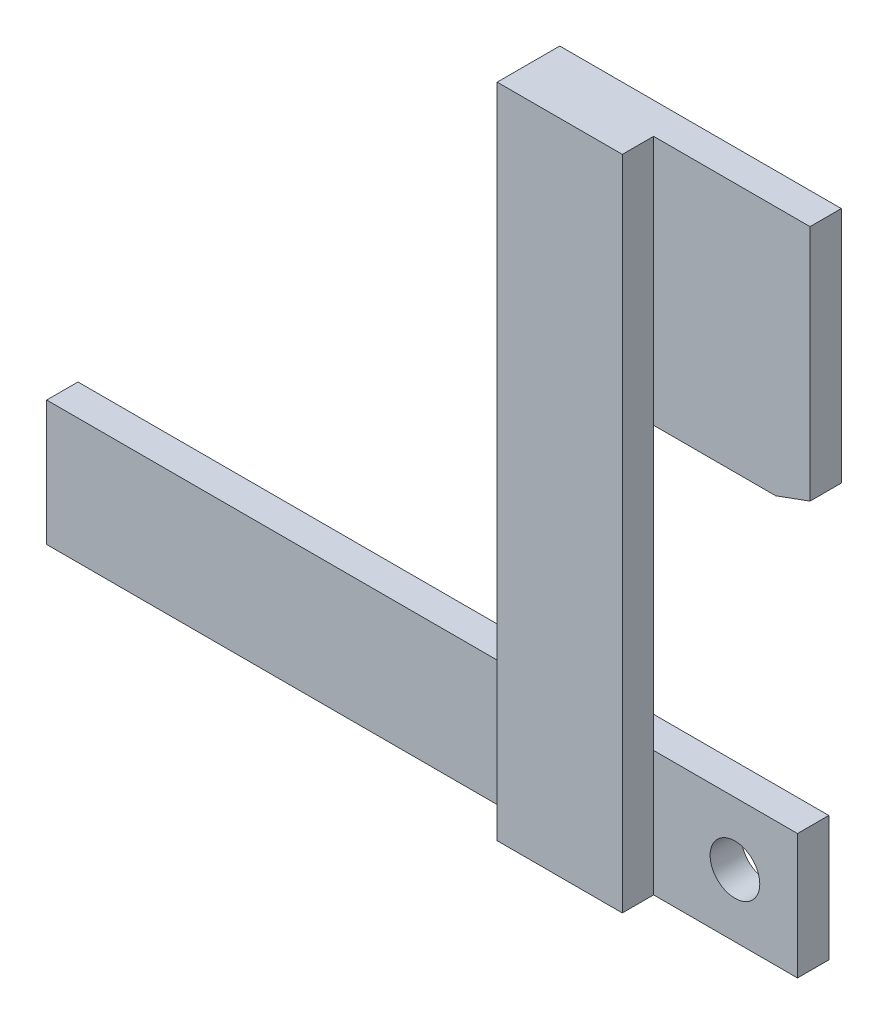
ISO-10303-21;
HEADER;
FILE_DESCRIPTION(('STEP AP214'),'2;1');
FILE_NAME('part.step','',(''),(''),'','','');
FILE_SCHEMA(('AUTOMOTIVE_DESIGN { 1 0 10303 214 1 1 1 1 }'));
ENDSEC;
DATA;
#1=APPLICATION_CONTEXT('core data for automotive mechanical design processes');
#2=APPLICATION_PROTOCOL_DEFINITION('international standard','automotive_design',2000,#1);
#3=PRODUCT_CONTEXT('',#1,'mechanical');
#4=PRODUCT('Part','Part','',(#3));
#5=PRODUCT_RELATED_PRODUCT_CATEGORY('part','',(#4));
#6=PRODUCT_DEFINITION_FORMATION('','',#4);
#7=PRODUCT_DEFINITION_CONTEXT('part definition',#1,'design');
#8=PRODUCT_DEFINITION('design','',#6,#7);
#9=PRODUCT_DEFINITION_SHAPE('','',#8);
#10=(LENGTH_UNIT() NAMED_UNIT(*) SI_UNIT(.MILLI.,.METRE.));
#11=(NAMED_UNIT(*) PLANE_ANGLE_UNIT() SI_UNIT($,.RADIAN.));
#12=(NAMED_UNIT(*) SI_UNIT($,.STERADIAN.) SOLID_ANGLE_UNIT());
#13=UNCERTAINTY_MEASURE_WITH_UNIT(LENGTH_MEASURE(1.E-05),#10,'distance_accuracy_value','');
#14=(GEOMETRIC_REPRESENTATION_CONTEXT(3) GLOBAL_UNCERTAINTY_ASSIGNED_CONTEXT((#13)) GLOBAL_UNIT_ASSIGNED_CONTEXT((#10,
#11,#12)) REPRESENTATION_CONTEXT('',''));
#15=CARTESIAN_POINT('',(0.,0.,0.));
#16=DIRECTION('',(0.,0.,1.));
#17=DIRECTION('',(1.,0.,0.));
#18=AXIS2_PLACEMENT_3D('',#15,#16,#17);
#19=CARTESIAN_POINT('',(46.9900000000001,120.65,6.35));
#20=DIRECTION('',(0.,0.,1.));
#21=DIRECTION('',(1.,0.,0.));
#22=AXIS2_PLACEMENT_3D('',#19,#20,#21);
#23=PLANE('',#22);
#24=DIRECTION('',(-1.,0.,0.));
#25=VECTOR('',#24,1.);
#26=CARTESIAN_POINT('',(21.5900000000001,69.85,6.35));
#27=LINE('',#26,#25);
#28=CARTESIAN_POINT('',(46.9900000000001,69.85,6.35));
#29=VERTEX_POINT('',#28);
#30=CARTESIAN_POINT('',(21.5900000000001,69.85,6.35));
#31=VERTEX_POINT('',#30);
#32=EDGE_CURVE('E164',#29,#31,#27,.T.);
#33=ORIENTED_EDGE('',*,*,#32,.F.);
#34=DIRECTION('',(0.,1.,0.));
#35=VECTOR('',#34,1.);
#36=CARTESIAN_POINT('',(46.9900000000001,-12.7,6.35));
#37=LINE('',#36,#35);
#38=CARTESIAN_POINT('',(46.9900000000001,12.7,6.35));
#39=VERTEX_POINT('',#38);
#40=EDGE_CURVE('E182',#39,#29,#37,.T.);
#41=ORIENTED_EDGE('',*,*,#40,.F.);
#42=DIRECTION('',(-1.,0.,0.));
#43=VECTOR('',#42,1.);
#44=CARTESIAN_POINT('',(-76.1999999999999,12.7,6.35));
#45=LINE('',#44,#43);
#46=CARTESIAN_POINT('',(21.5900000000001,12.7,6.35));
#47=VERTEX_POINT('',#46);
#48=EDGE_CURVE('E254',#39,#47,#45,.T.);
#49=ORIENTED_EDGE('',*,*,#48,.T.);
#50=DIRECTION('',(0.,-1.,0.));
#51=VECTOR('',#50,1.);
#52=CARTESIAN_POINT('',(21.5900000000001,-12.7,6.35));
#53=LINE('',#52,#51);
#54=EDGE_CURVE('E187',#31,#47,#53,.T.);
#55=ORIENTED_EDGE('',*,*,#54,.F.);
#56=EDGE_LOOP('',(#33,#41,#49,#55));
#57=FACE_BOUND('',#56,.T.);
#58=ADVANCED_FACE('F39',(#57),#23,.F.);
#59=CARTESIAN_POINT('',(76.2,12.7,6.35));
#60=DIRECTION('',(0.,0.,-1.));
#61=DIRECTION('',(-1.,0.,0.));
#62=AXIS2_PLACEMENT_3D('',#59,#60,#61);
#63=PLANE('',#62);
#64=CARTESIAN_POINT('',(63.5000000000001,0.,6.35));
#65=DIRECTION('',(0.,0.,1.));
#66=DIRECTION('',(1.,0.,0.));
#67=AXIS2_PLACEMENT_3D('',#64,#65,#66);
#68=CIRCLE('',#67,5.0419);
#69=CARTESIAN_POINT('',(68.5419000000001,0.,6.35));
#70=VERTEX_POINT('',#69);
#71=EDGE_CURVE('E459',#70,#70,#68,.T.);
#72=ORIENTED_EDGE('',*,*,#71,.F.);
#73=EDGE_LOOP('',(#72));
#74=FACE_BOUND('',#73,.T.);
#75=CARTESIAN_POINT('',(46.99,-12.7,6.35));
#76=VERTEX_POINT('',#75);
#77=EDGE_CURVE('E196',#76,#39,#37,.T.);
#78=ORIENTED_EDGE('',*,*,#77,.F.);
#79=DIRECTION('',(1.,0.,0.));
#80=VECTOR('',#79,1.);
#81=CARTESIAN_POINT('',(-76.1999999999999,-12.7,6.35));
#82=LINE('',#81,#80);
#83=CARTESIAN_POINT('',(76.2000000000001,-12.7,6.35));
#84=VERTEX_POINT('',#83);
#85=EDGE_CURVE('E223',#76,#84,#82,.T.);
#86=ORIENTED_EDGE('',*,*,#85,.T.);
#87=DIRECTION('',(0.,1.,0.));
#88=VECTOR('',#87,1.);
#89=CARTESIAN_POINT('',(76.2000000000001,-12.7,6.35));
#90=LINE('',#89,#88);
#91=CARTESIAN_POINT('',(76.2000000000001,12.7,6.35));
#92=VERTEX_POINT('',#91);
#93=EDGE_CURVE('E245',#84,#92,#90,.T.);
#94=ORIENTED_EDGE('',*,*,#93,.T.);
#95=EDGE_CURVE('E250',#92,#39,#45,.T.);
#96=ORIENTED_EDGE('',*,*,#95,.T.);
#97=EDGE_LOOP('',(#78,#86,#94,#96));
#98=FACE_BOUND('',#97,.T.);
#99=ADVANCED_FACE('F287',(#74,#98),#63,.F.);
#100=CARTESIAN_POINT('',(21.5900000000001,-12.7,6.35));
#101=VERTEX_POINT('',#100);
#102=EDGE_CURVE('E211',#47,#101,#53,.T.);
#103=ORIENTED_EDGE('',*,*,#102,.F.);
#104=CARTESIAN_POINT('',(-76.1999999999999,12.7,6.35));
#105=VERTEX_POINT('',#104);
#106=EDGE_CURVE('E248',#47,#105,#45,.T.);
#107=ORIENTED_EDGE('',*,*,#106,.T.);
#108=DIRECTION('',(0.,-1.,0.));
#109=VECTOR('',#108,1.);
#110=CARTESIAN_POINT('',(-76.1999999999999,-12.7,6.35));
#111=LINE('',#110,#109);
#112=CARTESIAN_POINT('',(-76.1999999999999,-12.7,6.35));
#113=VERTEX_POINT('',#112);
#114=EDGE_CURVE('E253',#105,#113,#111,.T.);
#115=ORIENTED_EDGE('',*,*,#114,.T.);
#116=EDGE_CURVE('E231',#113,#101,#82,.T.);
#117=ORIENTED_EDGE('',*,*,#116,.T.);
#118=EDGE_LOOP('',(#103,#107,#115,#117));
#119=FACE_BOUND('',#118,.T.);
#120=ADVANCED_FACE('F315',(#119),#63,.F.);
#121=CARTESIAN_POINT('',(76.2000000000001,-12.7,6.35));
#122=DIRECTION('',(-1.,0.,0.));
#123=DIRECTION('',(0.,0.,1.));
#124=AXIS2_PLACEMENT_3D('',#121,#122,#123);
#125=PLANE('',#124);
#126=DIRECTION('',(0.,1.,0.));
#127=VECTOR('',#126,1.);
#128=CARTESIAN_POINT('',(76.2000000000001,-12.7,0.));
#129=LINE('',#128,#127);
#130=CARTESIAN_POINT('',(76.2000000000001,-12.7,0.));
#131=VERTEX_POINT('',#130);
#132=CARTESIAN_POINT('',(76.2000000000001,12.7,0.));
#133=VERTEX_POINT('',#132);
#134=EDGE_CURVE('E239',#131,#133,#129,.T.);
#135=ORIENTED_EDGE('',*,*,#134,.T.);
#136=DIRECTION('',(0.,0.,-1.));
#137=VECTOR('',#136,1.);
#138=CARTESIAN_POINT('',(76.2000000000001,12.7,6.35));
#139=LINE('',#138,#137);
#140=EDGE_CURVE('E215',#92,#133,#139,.T.);
#141=ORIENTED_EDGE('',*,*,#140,.F.);
#142=ORIENTED_EDGE('',*,*,#93,.F.);
#143=DIRECTION('',(0.,0.,-1.));
#144=VECTOR('',#143,1.);
#145=CARTESIAN_POINT('',(76.2000000000001,-12.7,6.35));
#146=LINE('',#145,#144);
#147=EDGE_CURVE('E258',#84,#131,#146,.T.);
#148=ORIENTED_EDGE('',*,*,#147,.T.);
#149=EDGE_LOOP('',(#135,#141,#142,#148));
#150=FACE_BOUND('',#149,.T.);
#151=ADVANCED_FACE('F285',(#150),#125,.F.);
#152=CARTESIAN_POINT('',(-76.1999999999999,12.7,6.35));
#153=DIRECTION('',(0.,-1.,0.));
#154=DIRECTION('',(0.,0.,-1.));
#155=AXIS2_PLACEMENT_3D('',#152,#153,#154);
#156=PLANE('',#155);
#157=DIRECTION('',(-1.,0.,0.));
#158=VECTOR('',#157,1.);
#159=CARTESIAN_POINT('',(-76.1999999999999,12.7,0.));
#160=LINE('',#159,#158);
#161=CARTESIAN_POINT('',(-76.1999999999999,12.7,0.));
#162=VERTEX_POINT('',#161);
#163=EDGE_CURVE('E242',#133,#162,#160,.T.);
#164=ORIENTED_EDGE('',*,*,#163,.T.);
#165=DIRECTION('',(0.,0.,-1.));
#166=VECTOR('',#165,1.);
#167=CARTESIAN_POINT('',(-76.1999999999999,12.7,6.35));
#168=LINE('',#167,#166);
#169=EDGE_CURVE('E220',#105,#162,#168,.T.);
#170=ORIENTED_EDGE('',*,*,#169,.F.);
#171=ORIENTED_EDGE('',*,*,#106,.F.);
#172=ORIENTED_EDGE('',*,*,#48,.F.);
#173=ORIENTED_EDGE('',*,*,#95,.F.);
#174=ORIENTED_EDGE('',*,*,#140,.T.);
#175=EDGE_LOOP('',(#164,#170,#171,#172,#173,#174));
#176=FACE_BOUND('',#175,.T.);
#177=ADVANCED_FACE('F270',(#176),#156,.F.);
#178=CARTESIAN_POINT('',(-76.1999999999999,-12.7,6.35));
#179=DIRECTION('',(1.,0.,0.));
#180=DIRECTION('',(0.,0.,-1.));
#181=AXIS2_PLACEMENT_3D('',#178,#179,#180);
#182=PLANE('',#181);
#183=DIRECTION('',(0.,-1.,0.));
#184=VECTOR('',#183,1.);
#185=CARTESIAN_POINT('',(-76.1999999999999,-12.7,0.));
#186=LINE('',#185,#184);
#187=CARTESIAN_POINT('',(-76.1999999999999,-12.7,0.));
#188=VERTEX_POINT('',#187);
#189=EDGE_CURVE('E267',#162,#188,#186,.T.);
#190=ORIENTED_EDGE('',*,*,#189,.T.);
#191=DIRECTION('',(0.,0.,-1.));
#192=VECTOR('',#191,1.);
#193=CARTESIAN_POINT('',(-76.1999999999999,-12.7,6.35));
#194=LINE('',#193,#192);
#195=EDGE_CURVE('E262',#113,#188,#194,.T.);
#196=ORIENTED_EDGE('',*,*,#195,.F.);
#197=ORIENTED_EDGE('',*,*,#114,.F.);
#198=ORIENTED_EDGE('',*,*,#169,.T.);
#199=EDGE_LOOP('',(#190,#196,#197,#198));
#200=FACE_BOUND('',#199,.T.);
#201=ADVANCED_FACE('F278',(#200),#182,.F.);
#202=CARTESIAN_POINT('',(-76.1999999999999,-12.7,6.35));
#203=DIRECTION('',(0.,1.,0.));
#204=DIRECTION('',(0.,0.,1.));
#205=AXIS2_PLACEMENT_3D('',#202,#203,#204);
#206=PLANE('',#205);
#207=DIRECTION('',(1.,0.,0.));
#208=VECTOR('',#207,1.);
#209=CARTESIAN_POINT('',(-76.1999999999999,-12.7,0.));
#210=LINE('',#209,#208);
#211=EDGE_CURVE('E249',#188,#131,#210,.T.);
#212=ORIENTED_EDGE('',*,*,#211,.T.);
#213=ORIENTED_EDGE('',*,*,#147,.F.);
#214=ORIENTED_EDGE('',*,*,#85,.F.);
#215=DIRECTION('',(0.,0.,-1.));
#216=VECTOR('',#215,1.);
#217=CARTESIAN_POINT('',(46.9900000000001,-12.7,12.7));
#218=LINE('',#217,#216);
#219=CARTESIAN_POINT('',(46.9900000000001,-12.7,12.7));
#220=VERTEX_POINT('',#219);
#221=EDGE_CURVE('E192',#220,#76,#218,.T.);
#222=ORIENTED_EDGE('',*,*,#221,.F.);
#223=DIRECTION('',(1.,0.,0.));
#224=VECTOR('',#223,1.);
#225=CARTESIAN_POINT('',(46.9900000000001,-12.7,12.7));
#226=LINE('',#225,#224);
#227=CARTESIAN_POINT('',(21.5900000000001,-12.7,12.7));
#228=VERTEX_POINT('',#227);
#229=EDGE_CURVE('E190',#228,#220,#226,.T.);
#230=ORIENTED_EDGE('',*,*,#229,.F.);
#231=DIRECTION('',(0.,0.,-1.));
#232=VECTOR('',#231,1.);
#233=CARTESIAN_POINT('',(21.5900000000001,-12.7,12.7));
#234=LINE('',#233,#232);
#235=EDGE_CURVE('E147',#228,#101,#234,.T.);
#236=ORIENTED_EDGE('',*,*,#235,.T.);
#237=ORIENTED_EDGE('',*,*,#116,.F.);
#238=ORIENTED_EDGE('',*,*,#195,.T.);
#239=EDGE_LOOP('',(#212,#213,#214,#222,#230,#236,#237,#238));
#240=FACE_BOUND('',#239,.T.);
#241=ADVANCED_FACE('F229',(#240),#206,.F.);
#242=CARTESIAN_POINT('',(76.2,12.7,0.));
#243=DIRECTION('',(0.,0.,-1.));
#244=DIRECTION('',(-1.,0.,0.));
#245=AXIS2_PLACEMENT_3D('',#242,#243,#244);
#246=PLANE('',#245);
#247=CARTESIAN_POINT('',(63.5000000000001,0.,0.));
#248=DIRECTION('',(0.,0.,-1.));
#249=DIRECTION('',(-1.,0.,0.));
#250=AXIS2_PLACEMENT_3D('',#247,#248,#249);
#251=CIRCLE('',#250,5.04189999999999);
#252=CARTESIAN_POINT('',(58.4581000000001,0.,0.));
#253=VERTEX_POINT('',#252);
#254=EDGE_CURVE('E167',#253,#253,#251,.T.);
#255=ORIENTED_EDGE('',*,*,#254,.F.);
#256=EDGE_LOOP('',(#255));
#257=FACE_BOUND('',#256,.T.);
#258=ORIENTED_EDGE('',*,*,#134,.F.);
#259=ORIENTED_EDGE('',*,*,#211,.F.);
#260=ORIENTED_EDGE('',*,*,#189,.F.);
#261=ORIENTED_EDGE('',*,*,#163,.F.);
#262=EDGE_LOOP('',(#258,#259,#260,#261));
#263=FACE_BOUND('',#262,.T.);
#264=ADVANCED_FACE('F281',(#257,#263),#246,.T.);
#265=CARTESIAN_POINT('',(46.9900000000001,-12.7,12.7));
#266=DIRECTION('',(-1.,0.,0.));
#267=DIRECTION('',(0.,0.,1.));
#268=AXIS2_PLACEMENT_3D('',#265,#266,#267);
#269=PLANE('',#268);
#270=ORIENTED_EDGE('',*,*,#77,.T.);
#271=ORIENTED_EDGE('',*,*,#40,.T.);
#272=DIRECTION('',(0.,1.,0.));
#273=VECTOR('',#272,1.);
#274=CARTESIAN_POINT('',(46.9900000000001,-12.7,6.35));
#275=LINE('',#274,#273);
#276=CARTESIAN_POINT('',(46.9900000000001,120.65,6.35));
#277=VERTEX_POINT('',#276);
#278=EDGE_CURVE('E179',#29,#277,#275,.T.);
#279=ORIENTED_EDGE('',*,*,#278,.T.);
#280=DIRECTION('',(0.,0.,-1.));
#281=VECTOR('',#280,1.);
#282=CARTESIAN_POINT('',(46.9900000000001,120.65,12.7));
#283=LINE('',#282,#281);
#284=CARTESIAN_POINT('',(46.9900000000001,120.65,12.7));
#285=VERTEX_POINT('',#284);
#286=EDGE_CURVE('E146',#285,#277,#283,.T.);
#287=ORIENTED_EDGE('',*,*,#286,.F.);
#288=DIRECTION('',(0.,1.,0.));
#289=VECTOR('',#288,1.);
#290=CARTESIAN_POINT('',(46.9900000000001,-12.7,12.7));
#291=LINE('',#290,#289);
#292=EDGE_CURVE('E183',#220,#285,#291,.T.);
#293=ORIENTED_EDGE('',*,*,#292,.F.);
#294=ORIENTED_EDGE('',*,*,#221,.T.);
#295=EDGE_LOOP('',(#270,#271,#279,#287,#293,#294));
#296=FACE_BOUND('',#295,.T.);
#297=ADVANCED_FACE('F289',(#296),#269,.F.);
#298=CARTESIAN_POINT('',(46.9900000000001,120.65,12.7));
#299=DIRECTION('',(0.,-1.,0.));
#300=DIRECTION('',(1.,0.,0.));
#301=AXIS2_PLACEMENT_3D('',#298,#299,#300);
#302=PLANE('',#301);
#303=ORIENTED_EDGE('',*,*,#286,.T.);
#304=DIRECTION('',(1.,0.,0.));
#305=VECTOR('',#304,1.);
#306=CARTESIAN_POINT('',(21.5900000000001,120.65,6.35));
#307=LINE('',#306,#305);
#308=CARTESIAN_POINT('',(78.7400000000001,120.65,6.35));
#309=VERTEX_POINT('',#308);
#310=EDGE_CURVE('E173',#277,#309,#307,.T.);
#311=ORIENTED_EDGE('',*,*,#310,.T.);
#312=DIRECTION('',(0.,0.,1.));
#313=VECTOR('',#312,1.);
#314=CARTESIAN_POINT('',(78.7400000000001,120.65,0.));
#315=LINE('',#314,#313);
#316=CARTESIAN_POINT('',(78.7400000000001,120.65,0.));
#317=VERTEX_POINT('',#316);
#318=EDGE_CURVE('E154',#317,#309,#315,.T.);
#319=ORIENTED_EDGE('',*,*,#318,.F.);
#320=DIRECTION('',(1.,0.,0.));
#321=VECTOR('',#320,1.);
#322=CARTESIAN_POINT('',(21.5900000000001,120.65,0.));
#323=LINE('',#322,#321);
#324=CARTESIAN_POINT('',(21.5900000000001,120.65,0.));
#325=VERTEX_POINT('',#324);
#326=EDGE_CURVE('E150',#325,#317,#323,.T.);
#327=ORIENTED_EDGE('',*,*,#326,.F.);
#328=DIRECTION('',(0.,0.,-1.));
#329=VECTOR('',#328,1.);
#330=CARTESIAN_POINT('',(21.5900000000001,120.65,12.7));
#331=LINE('',#330,#329);
#332=CARTESIAN_POINT('',(21.5900000000001,120.65,12.7));
#333=VERTEX_POINT('',#332);
#334=EDGE_CURVE('E138',#333,#325,#331,.T.);
#335=ORIENTED_EDGE('',*,*,#334,.F.);
#336=DIRECTION('',(-1.,0.,0.));
#337=VECTOR('',#336,1.);
#338=CARTESIAN_POINT('',(46.9900000000001,120.65,12.7));
#339=LINE('',#338,#337);
#340=EDGE_CURVE('E186',#285,#333,#339,.T.);
#341=ORIENTED_EDGE('',*,*,#340,.F.);
#342=EDGE_LOOP('',(#303,#311,#319,#327,#335,#341));
#343=FACE_BOUND('',#342,.T.);
#344=ADVANCED_FACE('F152',(#343),#302,.F.);
#345=CARTESIAN_POINT('',(21.5900000000001,-12.7,12.7));
#346=DIRECTION('',(1.,0.,0.));
#347=DIRECTION('',(0.,0.,-1.));
#348=AXIS2_PLACEMENT_3D('',#345,#346,#347);
#349=PLANE('',#348);
#350=ORIENTED_EDGE('',*,*,#334,.T.);
#351=DIRECTION('',(0.,1.,0.));
#352=VECTOR('',#351,1.);
#353=CARTESIAN_POINT('',(21.5900000000001,120.65,0.));
#354=LINE('',#353,#352);
#355=CARTESIAN_POINT('',(21.5900000000001,69.85,0.));
#356=VERTEX_POINT('',#355);
#357=EDGE_CURVE('E142',#356,#325,#354,.T.);
#358=ORIENTED_EDGE('',*,*,#357,.F.);
#359=DIRECTION('',(0.,0.,1.));
#360=VECTOR('',#359,1.);
#361=CARTESIAN_POINT('',(21.5900000000001,69.85,0.));
#362=LINE('',#361,#360);
#363=EDGE_CURVE('E172',#356,#31,#362,.T.);
#364=ORIENTED_EDGE('',*,*,#363,.T.);
#365=ORIENTED_EDGE('',*,*,#54,.T.);
#366=ORIENTED_EDGE('',*,*,#102,.T.);
#367=ORIENTED_EDGE('',*,*,#235,.F.);
#368=DIRECTION('',(0.,-1.,0.));
#369=VECTOR('',#368,1.);
#370=CARTESIAN_POINT('',(21.5900000000001,-12.7,12.7));
#371=LINE('',#370,#369);
#372=EDGE_CURVE('E144',#333,#228,#371,.T.);
#373=ORIENTED_EDGE('',*,*,#372,.F.);
#374=EDGE_LOOP('',(#350,#358,#364,#365,#366,#367,#373));
#375=FACE_BOUND('',#374,.T.);
#376=ADVANCED_FACE('F140',(#375),#349,.F.);
#377=CARTESIAN_POINT('',(46.9900000000001,120.65,12.7));
#378=DIRECTION('',(0.,0.,1.));
#379=DIRECTION('',(1.,0.,0.));
#380=AXIS2_PLACEMENT_3D('',#377,#378,#379);
#381=PLANE('',#380);
#382=ORIENTED_EDGE('',*,*,#292,.T.);
#383=ORIENTED_EDGE('',*,*,#340,.T.);
#384=ORIENTED_EDGE('',*,*,#372,.T.);
#385=ORIENTED_EDGE('',*,*,#229,.T.);
#386=EDGE_LOOP('',(#382,#383,#384,#385));
#387=FACE_BOUND('',#386,.T.);
#388=ADVANCED_FACE('F236',(#387),#381,.T.);
#389=CARTESIAN_POINT('',(21.5900000000001,69.85,6.35));
#390=DIRECTION('',(0.,0.,1.));
#391=DIRECTION('',(1.,0.,0.));
#392=AXIS2_PLACEMENT_3D('',#389,#390,#391);
#393=PLANE('',#392);
#394=CARTESIAN_POINT('',(71.7614073545854,69.85,6.35));
#395=VERTEX_POINT('',#394);
#396=EDGE_CURVE('E162',#395,#29,#27,.T.);
#397=ORIENTED_EDGE('',*,*,#396,.F.);
#398=DIRECTION('',(-0.939692620785908,-0.342020143325671,0.));
#399=VECTOR('',#398,1.);
#400=CARTESIAN_POINT('',(27.4589397735735,53.7252204959681,6.35));
#401=LINE('',#400,#399);
#402=CARTESIAN_POINT('',(78.7400000000001,72.39,6.35));
#403=VERTEX_POINT('',#402);
#404=EDGE_CURVE('E61',#395,#403,#401,.F.);
#405=ORIENTED_EDGE('',*,*,#404,.T.);
#406=DIRECTION('',(0.,-1.,0.));
#407=VECTOR('',#406,1.);
#408=CARTESIAN_POINT('',(78.7400000000001,120.65,6.35));
#409=LINE('',#408,#407);
#410=EDGE_CURVE('E175',#309,#403,#409,.T.);
#411=ORIENTED_EDGE('',*,*,#410,.F.);
#412=ORIENTED_EDGE('',*,*,#310,.F.);
#413=ORIENTED_EDGE('',*,*,#278,.F.);
#414=EDGE_LOOP('',(#397,#405,#411,#412,#413));
#415=FACE_BOUND('',#414,.T.);
#416=ADVANCED_FACE('F297',(#415),#393,.T.);
#417=CARTESIAN_POINT('',(78.7400000000001,120.65,0.));
#418=DIRECTION('',(-1.,0.,0.));
#419=DIRECTION('',(0.,0.,1.));
#420=AXIS2_PLACEMENT_3D('',#417,#418,#419);
#421=PLANE('',#420);
#422=ORIENTED_EDGE('',*,*,#410,.T.);
#423=DIRECTION('',(0.,0.,-1.));
#424=VECTOR('',#423,1.);
#425=CARTESIAN_POINT('',(78.7400000000001,72.39,0.));
#426=LINE('',#425,#424);
#427=CARTESIAN_POINT('',(78.7400000000001,72.39,0.));
#428=VERTEX_POINT('',#427);
#429=EDGE_CURVE('E47',#403,#428,#426,.T.);
#430=ORIENTED_EDGE('',*,*,#429,.T.);
#431=DIRECTION('',(0.,-1.,0.));
#432=VECTOR('',#431,1.);
#433=CARTESIAN_POINT('',(78.7400000000001,120.65,0.));
#434=LINE('',#433,#432);
#435=EDGE_CURVE('E156',#317,#428,#434,.T.);
#436=ORIENTED_EDGE('',*,*,#435,.F.);
#437=ORIENTED_EDGE('',*,*,#318,.T.);
#438=EDGE_LOOP('',(#422,#430,#436,#437));
#439=FACE_BOUND('',#438,.T.);
#440=ADVANCED_FACE('F298',(#439),#421,.F.);
#441=CARTESIAN_POINT('',(21.5900000000001,69.85,0.));
#442=DIRECTION('',(0.,1.,0.));
#443=DIRECTION('',(0.,0.,1.));
#444=AXIS2_PLACEMENT_3D('',#441,#442,#443);
#445=PLANE('',#444);
#446=DIRECTION('',(-1.,0.,0.));
#447=VECTOR('',#446,1.);
#448=CARTESIAN_POINT('',(21.5900000000001,69.85,0.));
#449=LINE('',#448,#447);
#450=CARTESIAN_POINT('',(71.7614073545853,69.85,0.));
#451=VERTEX_POINT('',#450);
#452=EDGE_CURVE('E160',#451,#356,#449,.T.);
#453=ORIENTED_EDGE('',*,*,#452,.F.);
#454=DIRECTION('',(0.,0.,1.));
#455=VECTOR('',#454,1.);
#456=CARTESIAN_POINT('',(71.7614073545854,69.85,0.));
#457=LINE('',#456,#455);
#458=EDGE_CURVE('E208',#451,#395,#457,.T.);
#459=ORIENTED_EDGE('',*,*,#458,.T.);
#460=ORIENTED_EDGE('',*,*,#396,.T.);
#461=ORIENTED_EDGE('',*,*,#32,.T.);
#462=ORIENTED_EDGE('',*,*,#363,.F.);
#463=EDGE_LOOP('',(#453,#459,#460,#461,#462));
#464=FACE_BOUND('',#463,.T.);
#465=ADVANCED_FACE('F296',(#464),#445,.F.);
#466=CARTESIAN_POINT('',(21.5900000000001,69.85,0.));
#467=DIRECTION('',(0.,0.,1.));
#468=DIRECTION('',(1.,0.,0.));
#469=AXIS2_PLACEMENT_3D('',#466,#467,#468);
#470=PLANE('',#469);
#471=ORIENTED_EDGE('',*,*,#435,.T.);
#472=DIRECTION('',(0.939692620785908,0.342020143325671,0.));
#473=VECTOR('',#472,1.);
#474=CARTESIAN_POINT('',(71.7614073545854,69.85,0.));
#475=LINE('',#474,#473);
#476=EDGE_CURVE('E11',#428,#451,#475,.F.);
#477=ORIENTED_EDGE('',*,*,#476,.T.);
#478=ORIENTED_EDGE('',*,*,#452,.T.);
#479=ORIENTED_EDGE('',*,*,#357,.T.);
#480=ORIENTED_EDGE('',*,*,#326,.T.);
#481=EDGE_LOOP('',(#471,#477,#478,#479,#480));
#482=FACE_BOUND('',#481,.T.);
#483=ADVANCED_FACE('F158',(#482),#470,.F.);
#484=CARTESIAN_POINT('',(71.7614073545854,69.85,0.));
#485=DIRECTION('',(-0.342020143325671,0.939692620785908,0.));
#486=DIRECTION('',(-0.939692620785908,-0.342020143325671,0.));
#487=AXIS2_PLACEMENT_3D('',#484,#485,#486);
#488=PLANE('',#487);
#489=ORIENTED_EDGE('',*,*,#476,.F.);
#490=ORIENTED_EDGE('',*,*,#429,.F.);
#491=ORIENTED_EDGE('',*,*,#404,.F.);
#492=ORIENTED_EDGE('',*,*,#458,.F.);
#493=EDGE_LOOP('',(#489,#490,#491,#492));
#494=FACE_BOUND('',#493,.T.);
#495=ADVANCED_FACE('F41',(#494),#488,.F.);
#496=CARTESIAN_POINT('',(63.5000000000001,0.,6.35));
#497=DIRECTION('',(0.,0.,1.));
#498=DIRECTION('',(1.,0.,0.));
#499=AXIS2_PLACEMENT_3D('',#496,#497,#498);
#500=CYLINDRICAL_SURFACE('',#499,5.04189999999999);
#501=ORIENTED_EDGE('',*,*,#254,.T.);
#502=EDGE_LOOP('',(#501));
#503=FACE_BOUND('',#502,.T.);
#504=ORIENTED_EDGE('',*,*,#71,.T.);
#505=EDGE_LOOP('',(#504));
#506=FACE_BOUND('',#505,.T.);
#507=ADVANCED_FACE('F302',(#503,#506),#500,.F.);
#508=CLOSED_SHELL('',(#58,#99,#120,#151,#177,#201,#241,#264,#297,#344,#376,#388,#416,#440,#465,
#483,#495,#507));
#509=MANIFOLD_SOLID_BREP('B2',#508);
#510=ADVANCED_BREP_SHAPE_REPRESENTATION('',(#18,#509),#14);
#511=SHAPE_DEFINITION_REPRESENTATION(#9,#510);
ENDSEC;
END-ISO-10303-21;
